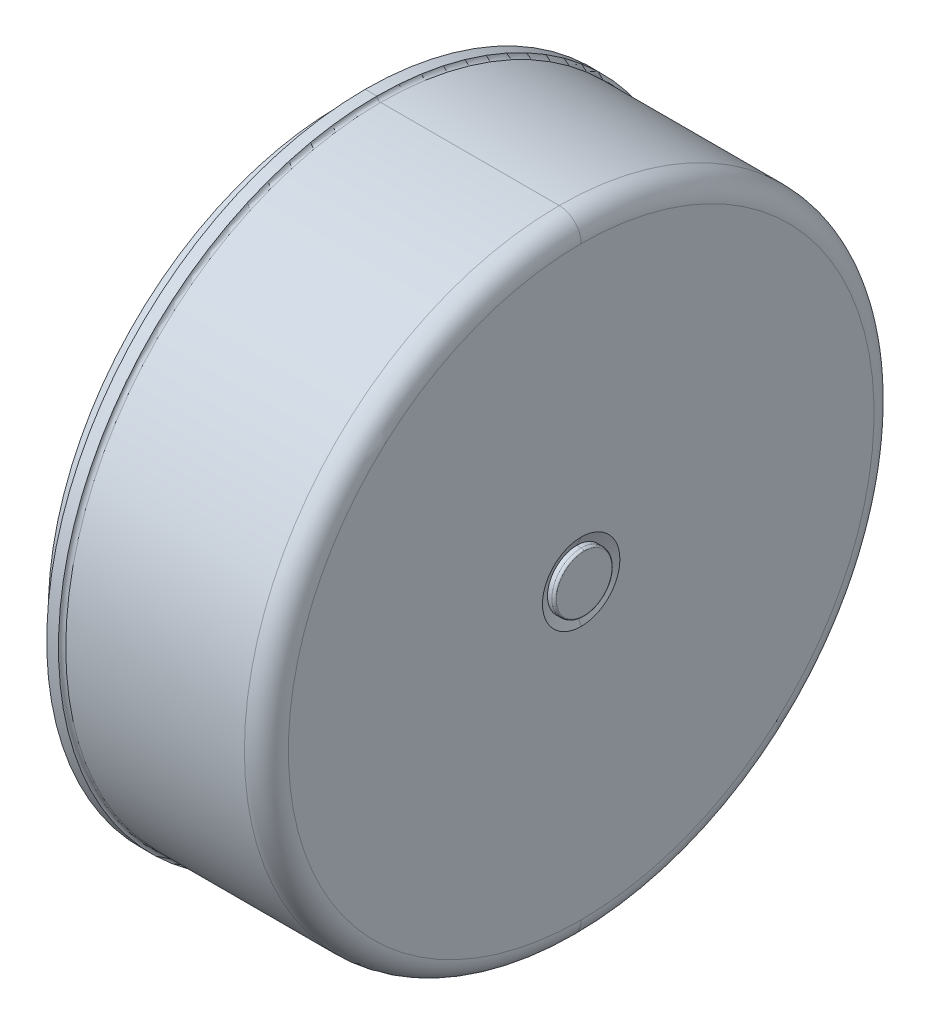
ISO-10303-21;
HEADER;
FILE_DESCRIPTION(('STEP AP214'),'2;1');
FILE_NAME('part.step','',(''),(''),'','','');
FILE_SCHEMA(('AUTOMOTIVE_DESIGN { 1 0 10303 214 1 1 1 1 }'));
ENDSEC;
DATA;
#1=APPLICATION_CONTEXT('core data for automotive mechanical design processes');
#2=APPLICATION_PROTOCOL_DEFINITION('international standard','automotive_design',2000,#1);
#3=PRODUCT_CONTEXT('',#1,'mechanical');
#4=PRODUCT('Part','Part','',(#3));
#5=PRODUCT_RELATED_PRODUCT_CATEGORY('part','',(#4));
#6=PRODUCT_DEFINITION_FORMATION('','',#4);
#7=PRODUCT_DEFINITION_CONTEXT('part definition',#1,'design');
#8=PRODUCT_DEFINITION('design','',#6,#7);
#9=PRODUCT_DEFINITION_SHAPE('','',#8);
#10=(LENGTH_UNIT() NAMED_UNIT(*) SI_UNIT(.MILLI.,.METRE.));
#11=(NAMED_UNIT(*) PLANE_ANGLE_UNIT() SI_UNIT($,.RADIAN.));
#12=(NAMED_UNIT(*) SI_UNIT($,.STERADIAN.) SOLID_ANGLE_UNIT());
#13=UNCERTAINTY_MEASURE_WITH_UNIT(LENGTH_MEASURE(1.E-05),#10,'distance_accuracy_value','');
#14=(GEOMETRIC_REPRESENTATION_CONTEXT(3) GLOBAL_UNCERTAINTY_ASSIGNED_CONTEXT((#13)) GLOBAL_UNIT_ASSIGNED_CONTEXT((#10,
#11,#12)) REPRESENTATION_CONTEXT('',''));
#15=CARTESIAN_POINT('',(0.,0.,0.));
#16=DIRECTION('',(0.,0.,1.));
#17=DIRECTION('',(1.,0.,0.));
#18=AXIS2_PLACEMENT_3D('',#15,#16,#17);
#19=CARTESIAN_POINT('',(5.6,0.,0.));
#20=DIRECTION('',(1.,0.,0.));
#21=DIRECTION('',(0.,0.,-1.));
#22=AXIS2_PLACEMENT_3D('',#19,#20,#21);
#23=PLANE('',#22);
#24=CARTESIAN_POINT('',(5.6,0.,0.));
#25=DIRECTION('',(-1.,0.,0.));
#26=DIRECTION('',(0.,1.,0.));
#27=AXIS2_PLACEMENT_3D('',#24,#25,#26);
#28=CIRCLE('',#27,20.);
#29=CARTESIAN_POINT('',(5.6,20.,0.));
#30=VERTEX_POINT('',#29);
#31=CARTESIAN_POINT('',(5.6,-20.,0.));
#32=VERTEX_POINT('',#31);
#33=EDGE_CURVE('E56',#30,#32,#28,.T.);
#34=ORIENTED_EDGE('',*,*,#33,.T.);
#35=CARTESIAN_POINT('',(5.6,0.,0.));
#36=DIRECTION('',(1.,0.,0.));
#37=DIRECTION('',(0.,1.,0.));
#38=AXIS2_PLACEMENT_3D('',#35,#36,#37);
#39=CIRCLE('',#38,20.);
#40=EDGE_CURVE('E11',#30,#32,#39,.T.);
#41=ORIENTED_EDGE('',*,*,#40,.F.);
#42=EDGE_LOOP('',(#34,#41));
#43=FACE_BOUND('',#42,.T.);
#44=CARTESIAN_POINT('',(5.6,-5.5,9.526279441629));
#45=DIRECTION('',(1.,0.,0.));
#46=DIRECTION('',(0.,0.,-1.));
#47=AXIS2_PLACEMENT_3D('',#44,#45,#46);
#48=CIRCLE('',#47,1.25);
#49=CARTESIAN_POINT('',(5.6,-4.25,9.526279441629));
#50=VERTEX_POINT('',#49);
#51=CARTESIAN_POINT('',(5.6,-6.75,9.526279441629));
#52=VERTEX_POINT('',#51);
#53=EDGE_CURVE('E331',#50,#52,#48,.F.);
#54=ORIENTED_EDGE('',*,*,#53,.F.);
#55=CARTESIAN_POINT('',(5.6,-5.5,9.526279441629));
#56=DIRECTION('',(1.,0.,0.));
#57=DIRECTION('',(0.,0.,-1.));
#58=AXIS2_PLACEMENT_3D('',#55,#56,#57);
#59=CIRCLE('',#58,1.25);
#60=EDGE_CURVE('E1098',#52,#50,#59,.F.);
#61=ORIENTED_EDGE('',*,*,#60,.F.);
#62=EDGE_LOOP('',(#54,#61));
#63=FACE_BOUND('',#62,.T.);
#64=CARTESIAN_POINT('',(5.6,-5.5,-9.526279441629));
#65=DIRECTION('',(1.,0.,0.));
#66=DIRECTION('',(0.,0.,-1.));
#67=AXIS2_PLACEMENT_3D('',#64,#65,#66);
#68=CIRCLE('',#67,1.25);
#69=CARTESIAN_POINT('',(5.6,-6.125,-8.443747686898));
#70=VERTEX_POINT('',#69);
#71=CARTESIAN_POINT('',(5.6,-4.875,-10.60881119636));
#72=VERTEX_POINT('',#71);
#73=EDGE_CURVE('E1096',#70,#72,#68,.F.);
#74=ORIENTED_EDGE('',*,*,#73,.F.);
#75=CARTESIAN_POINT('',(5.6,-5.5,-9.526279441629));
#76=DIRECTION('',(1.,0.,0.));
#77=DIRECTION('',(0.,0.,-1.));
#78=AXIS2_PLACEMENT_3D('',#75,#76,#77);
#79=CIRCLE('',#78,1.25);
#80=EDGE_CURVE('E207',#72,#70,#79,.F.);
#81=ORIENTED_EDGE('',*,*,#80,.F.);
#82=EDGE_LOOP('',(#74,#81));
#83=FACE_BOUND('',#82,.T.);
#84=CARTESIAN_POINT('',(5.6,11.,0.));
#85=DIRECTION('',(1.,0.,0.));
#86=DIRECTION('',(0.,0.,-1.));
#87=AXIS2_PLACEMENT_3D('',#84,#85,#86);
#88=CIRCLE('',#87,1.25);
#89=CARTESIAN_POINT('',(5.6,10.375,-1.082531754731));
#90=VERTEX_POINT('',#89);
#91=CARTESIAN_POINT('',(5.6,11.625,1.082531754731));
#92=VERTEX_POINT('',#91);
#93=EDGE_CURVE('E360',#90,#92,#88,.F.);
#94=ORIENTED_EDGE('',*,*,#93,.F.);
#95=CARTESIAN_POINT('',(5.6,11.,0.));
#96=DIRECTION('',(1.,0.,0.));
#97=DIRECTION('',(0.,0.,-1.));
#98=AXIS2_PLACEMENT_3D('',#95,#96,#97);
#99=CIRCLE('',#98,1.25);
#100=EDGE_CURVE('E367',#92,#90,#99,.F.);
#101=ORIENTED_EDGE('',*,*,#100,.F.);
#102=EDGE_LOOP('',(#94,#101));
#103=FACE_BOUND('',#102,.T.);
#104=ADVANCED_FACE('F53',(#43,#63,#83,#103),#23,.F.);
#105=CARTESIAN_POINT('',(22.2,0.,0.));
#106=DIRECTION('',(1.,0.,0.));
#107=DIRECTION('',(0.,1.,0.));
#108=AXIS2_PLACEMENT_3D('',#105,#106,#107);
#109=PLANE('',#108);
#110=CARTESIAN_POINT('',(22.2,0.,0.));
#111=DIRECTION('',(1.,0.,0.));
#112=DIRECTION('',(0.,1.,0.));
#113=AXIS2_PLACEMENT_3D('',#110,#111,#112);
#114=CIRCLE('',#113,1.9);
#115=CARTESIAN_POINT('',(22.2,1.9,0.));
#116=VERTEX_POINT('',#115);
#117=CARTESIAN_POINT('',(22.2,-1.9,0.));
#118=VERTEX_POINT('',#117);
#119=EDGE_CURVE('E543',#116,#118,#114,.T.);
#120=ORIENTED_EDGE('',*,*,#119,.T.);
#121=CARTESIAN_POINT('',(22.2,0.,0.));
#122=DIRECTION('',(-1.,0.,0.));
#123=DIRECTION('',(0.,1.,0.));
#124=AXIS2_PLACEMENT_3D('',#121,#122,#123);
#125=CIRCLE('',#124,1.9);
#126=EDGE_CURVE('E155',#116,#118,#125,.T.);
#127=ORIENTED_EDGE('',*,*,#126,.F.);
#128=EDGE_LOOP('',(#120,#127));
#129=FACE_BOUND('',#128,.T.);
#130=ADVANCED_FACE('F424',(#129),#109,.T.);
#131=CARTESIAN_POINT('',(22.,2.,0.));
#132=CARTESIAN_POINT('',(22.05,2.,0.));
#133=CARTESIAN_POINT('',(22.11332370056,1.988323700558,0.));
#134=CARTESIAN_POINT('',(22.17599443568,1.950994435682,0.));
#135=CARTESIAN_POINT('',(22.2,1.925,0.));
#136=CARTESIAN_POINT('',(22.2,1.9,0.));
#137=(BOUNDED_CURVE() B_SPLINE_CURVE(3,(#131,#132,#133,#134,#135,#136),.UNSPECIFIED.,.F.,
.F.) B_SPLINE_CURVE_WITH_KNOTS((4,1,1,4),(0.,0.5,0.75,1.),
.UNSPECIFIED.) CURVE() GEOMETRIC_REPRESENTATION_ITEM() RATIONAL_B_SPLINE_CURVE((1.,1.,1.,1.,1.,1.)) REPRESENTATION_ITEM(''));
#138=CARTESIAN_POINT('',(0.,0.,0.));
#139=DIRECTION('',(-1.,0.,0.));
#140=AXIS1_PLACEMENT('',#138,#139);
#141=SURFACE_OF_REVOLUTION('',#137,#140);
#142=CARTESIAN_POINT('',(22.2,1.9,0.));
#143=CARTESIAN_POINT('',(22.1999999963486,1.90076972409339,0.));
#144=CARTESIAN_POINT('',(22.1999886217891,1.90153949709287,0.));
#145=CARTESIAN_POINT('',(22.1999423446817,1.90305618790682,0.));
#146=CARTESIAN_POINT('',(22.1999081275483,1.90380312691137,0.));
#147=CARTESIAN_POINT('',(22.19981681051,1.90527477820813,0.));
#148=CARTESIAN_POINT('',(22.199760373235,1.90599953110398,0.));
#149=CARTESIAN_POINT('',(22.1996252603649,1.90742740269701,0.));
#150=CARTESIAN_POINT('',(22.1995472203907,1.9081305812576,0.));
#151=CARTESIAN_POINT('',(22.1993695523586,1.9095159074431,0.));
#152=CARTESIAN_POINT('',(22.1992705286844,1.91019813228242,0.));
#153=CARTESIAN_POINT('',(22.1990515473371,1.91154215368517,0.));
#154=CARTESIAN_POINT('',(22.198932158955,1.91220404275525,0.));
#155=CARTESIAN_POINT('',(22.1986731061727,1.91350799819556,0.));
#156=CARTESIAN_POINT('',(22.1985339725816,1.9141501698093,0.));
#157=CARTESIAN_POINT('',(22.1982360906019,1.91541529846603,0.));
#158=CARTESIAN_POINT('',(22.198077831773,1.91603837060995,0.));
#159=CARTESIAN_POINT('',(22.1977423631221,1.91726591154533,0.));
#160=CARTESIAN_POINT('',(22.1975655995829,1.91787050217099,0.));
#161=CARTESIAN_POINT('',(22.1971937870899,1.91906169454605,0.));
#162=CARTESIAN_POINT('',(22.1969991399462,1.9196484216248,0.));
#163=CARTESIAN_POINT('',(22.1965922267156,1.92080450474062,0.));
#164=CARTESIAN_POINT('',(22.1963803176522,1.92137398638699,0.));
#165=CARTESIAN_POINT('',(22.1959395470276,1.92249619976858,0.));
#166=CARTESIAN_POINT('',(22.1957109982758,1.92304905434195,0.));
#167=CARTESIAN_POINT('',(22.1952376137846,1.92413863780363,0.));
#168=CARTESIAN_POINT('',(22.1949930480571,1.92467548400372,0.));
#169=CARTESIAN_POINT('',(22.1944882933531,1.92573367769828,0.));
#170=CARTESIAN_POINT('',(22.1942283337643,1.92625513463076,0.));
#171=CARTESIAN_POINT('',(22.193693452532,1.92728317910387,0.));
#172=CARTESIAN_POINT('',(22.1934187224603,1.92778986635144,0.));
#173=CARTESIAN_POINT('',(22.1928549584296,1.92878900249355,0.));
#174=CARTESIAN_POINT('',(22.1925660815194,1.92928154004604,0.));
#175=CARTESIAN_POINT('',(22.1919746780725,1.93025300933252,0.));
#176=CARTESIAN_POINT('',(22.191672277683,1.93073201790467,0.));
#177=CARTESIAN_POINT('',(22.1910544789802,1.9316770614859,0.));
#178=CARTESIAN_POINT('',(22.1907391796865,1.93214316127871,0.));
#179=CARTESIAN_POINT('',(22.1900962262261,1.9330630232324,0.));
#180=CARTESIAN_POINT('',(22.1897686477768,1.93351683833551,0.));
#181=CARTESIAN_POINT('',(22.1891017925865,1.93441275346625,0.));
#182=CARTESIAN_POINT('',(22.1887625718607,1.93485489529193,0.));
#183=CARTESIAN_POINT('',(22.1877296909386,1.93616292188001,0.));
#184=CARTESIAN_POINT('',(22.1870178917349,1.93701456196849,0.));
#185=CARTESIAN_POINT('',(22.1855550726117,1.9386783107714,0.));
#186=CARTESIAN_POINT('',(22.1848041877525,1.93949053902511,0.));
#187=CARTESIAN_POINT('',(22.1832682569264,1.94108064909264,0.));
#188=CARTESIAN_POINT('',(22.1824832388966,1.94185855798304,0.));
#189=CARTESIAN_POINT('',(22.1808840911699,1.94338506729576,0.));
#190=CARTESIAN_POINT('',(22.180069937876,1.94413364288357,0.));
#191=CARTESIAN_POINT('',(22.1784174951616,1.9456065161494,0.));
#192=CARTESIAN_POINT('',(22.1775791660817,1.94633076915663,0.));
#193=CARTESIAN_POINT('',(22.1758833514163,1.94775997424288,0.));
#194=CARTESIAN_POINT('',(22.1750258298209,1.94846488333931,0.));
#195=CARTESIAN_POINT('',(22.1724288876869,1.95056055147684,0.));
#196=CARTESIAN_POINT('',(22.170670338509,1.95192769203043,0.));
#197=CARTESIAN_POINT('',(22.1670962989447,1.95460501915037,0.));
#198=CARTESIAN_POINT('',(22.16528056173,1.95591487573703,0.));
#199=CARTESIAN_POINT('',(22.1615922343171,1.95847783579483,0.));
#200=CARTESIAN_POINT('',(22.1597193549011,1.95973052298195,0.));
#201=CARTESIAN_POINT('',(22.1559168668612,1.96217929353493,0.));
#202=CARTESIAN_POINT('',(22.1539869359123,1.96337487606539,0.));
#203=CARTESIAN_POINT('',(22.1500704472482,1.96570959781149,0.));
#204=CARTESIAN_POINT('',(22.1480835428396,1.96684815508455,0.));
#205=CARTESIAN_POINT('',(22.1440532047216,1.96906897932263,0.));
#206=CARTESIAN_POINT('',(22.1420094083861,1.97015058769423,0.));
#207=CARTESIAN_POINT('',(22.1378653723998,1.9722576637224,0.));
#208=CARTESIAN_POINT('',(22.1357647619658,1.97328240157505,0.));
#209=CARTESIAN_POINT('',(22.1315071848741,1.97527587880338,0.));
#210=CARTESIAN_POINT('',(22.1293498464536,1.97624382330156,0.));
#211=CARTESIAN_POINT('',(22.12497883327,1.9781238671592,0.));
#212=CARTESIAN_POINT('',(22.1227647912511,1.97903511243054,0.));
#213=CARTESIAN_POINT('',(22.1182802141301,1.98080152777479,0.));
#214=CARTESIAN_POINT('',(22.1160093196038,1.98165578198373,0.));
#215=CARTESIAN_POINT('',(22.1090606626561,1.98415235436172,0.));
#216=CARTESIAN_POINT('',(22.1043438019041,1.98568695065004,0.));
#217=CARTESIAN_POINT('',(22.0946823930452,1.98853318323209,0.));
#218=CARTESIAN_POINT('',(22.0897353530705,1.98983627368044,0.));
#219=CARTESIAN_POINT('',(22.0796107605387,1.99221827886771,0.));
#220=CARTESIAN_POINT('',(22.0744310785397,1.99328809728031,0.));
#221=CARTESIAN_POINT('',(22.0638388600609,1.99520192813131,0.));
#222=CARTESIAN_POINT('',(22.0584246296585,1.99603647731862,0.));
#223=CARTESIAN_POINT('',(22.0473607171085,1.9974779722336,0.));
#224=CARTESIAN_POINT('',(22.0417097894869,1.99807526018237,0.));
#225=CARTESIAN_POINT('',(22.0301701457211,1.99904044324431,0.));
#226=CARTESIAN_POINT('',(22.0242806376055,1.99939863985782,0.));
#227=CARTESIAN_POINT('',(22.0122605941812,1.9998829748011,0.));
#228=CARTESIAN_POINT('',(22.0061296609684,1.99999946566372,0.));
#229=CARTESIAN_POINT('',(22.,2.,0.));
#230=B_SPLINE_CURVE_WITH_KNOTS('',3,(#142,#143,#144,#145,#146,#147,#148,#149,#150,#151,#152,
#153,#154,#155,#156,#157,#158,#159,#160,#161,#162,#163,#164,#165,#166,#167,#168,#169,#170,#171,
#172,#173,#174,#175,#176,#177,#178,#179,#180,#181,#182,#183,#184,#185,#186,#187,#188,#189,#190,
#191,#192,#193,#194,#195,#196,#197,#198,#199,#200,#201,#202,#203,#204,#205,#206,#207,#208,#209,
#210,#211,#212,#213,#214,#215,#216,#217,#218,#219,#220,#221,#222,#223,#224,#225,#226,#227,#228,
#229),.UNSPECIFIED.,.F.,.F.,(4,2,2,2,2,2,2,2,2,2,2,2,2,2,2,2,2,2,2,2,2,2,2,2,2,2,2,2,2,2,2,2,2,
2,2,2,2,2,2,2,2,2,2,4),(0.,0.00230915902818518,0.00455196956525164,0.0067324259475015,
0.00885452392010384,0.0109222477001617,0.0129395553961479,0.0149103629411108,0.0168385267847553,
0.0187278256764038,0.0205819419490742,0.0224044427765769,0.0241987619134426,0.0259681824360872,
0.0277158209805459,0.0294446139182486,0.0311573058308861,0.0328564405458137,0.0345443548835183,
0.0362231751577572,0.0378948163662452,0.041222887186978,0.0445401361207777,0.0478547192822488,
0.0511720505780285,0.0544951738756183,0.0578251650591542,0.0645059916752151,0.0712212627904091,
0.0779794579577462,0.0847888626802041,0.0916575437838994,0.098593328274363,0.105603785801629,
0.112696214745119,0.119877722511908,0.127155536801351,0.142026841802226,0.157366588369195,
0.173226315296921,0.189654254399268,0.206695356291891,0.22439139844897,0.242781150163145),.UNSPECIFIED.);
#231=CARTESIAN_POINT('',(22.,2.,0.));
#232=VERTEX_POINT('',#231);
#233=EDGE_CURVE('E546',#116,#232,#230,.T.);
#234=ORIENTED_EDGE('',*,*,#233,.F.);
#235=ORIENTED_EDGE('',*,*,#126,.T.);
#236=CARTESIAN_POINT('',(22.2,-1.9,0.));
#237=CARTESIAN_POINT('',(22.1999999963486,-1.90076972409339,0.));
#238=CARTESIAN_POINT('',(22.1999886217891,-1.90153949709287,0.));
#239=CARTESIAN_POINT('',(22.1999423446817,-1.90305618790682,0.));
#240=CARTESIAN_POINT('',(22.1999081275483,-1.90380312691137,0.));
#241=CARTESIAN_POINT('',(22.19981681051,-1.90527477820813,0.));
#242=CARTESIAN_POINT('',(22.199760373235,-1.90599953110398,0.));
#243=CARTESIAN_POINT('',(22.1996252603649,-1.90742740269701,0.));
#244=CARTESIAN_POINT('',(22.1995472203907,-1.9081305812576,0.));
#245=CARTESIAN_POINT('',(22.1993695523586,-1.9095159074431,0.));
#246=CARTESIAN_POINT('',(22.1992705286844,-1.91019813228242,0.));
#247=CARTESIAN_POINT('',(22.1990515473371,-1.91154215368517,0.));
#248=CARTESIAN_POINT('',(22.198932158955,-1.91220404275525,0.));
#249=CARTESIAN_POINT('',(22.1986731061727,-1.91350799819556,0.));
#250=CARTESIAN_POINT('',(22.1985339725816,-1.9141501698093,0.));
#251=CARTESIAN_POINT('',(22.1982360906019,-1.91541529846603,0.));
#252=CARTESIAN_POINT('',(22.198077831773,-1.91603837060995,0.));
#253=CARTESIAN_POINT('',(22.1977423631221,-1.91726591154533,0.));
#254=CARTESIAN_POINT('',(22.1975655995829,-1.91787050217099,0.));
#255=CARTESIAN_POINT('',(22.1971937870899,-1.91906169454605,0.));
#256=CARTESIAN_POINT('',(22.1969991399462,-1.9196484216248,0.));
#257=CARTESIAN_POINT('',(22.1965922267156,-1.92080450474062,0.));
#258=CARTESIAN_POINT('',(22.1963803176522,-1.92137398638699,0.));
#259=CARTESIAN_POINT('',(22.1959395470276,-1.92249619976858,0.));
#260=CARTESIAN_POINT('',(22.1957109982758,-1.92304905434195,0.));
#261=CARTESIAN_POINT('',(22.1952376137846,-1.92413863780363,0.));
#262=CARTESIAN_POINT('',(22.1949930480571,-1.92467548400372,0.));
#263=CARTESIAN_POINT('',(22.1944882933531,-1.92573367769828,0.));
#264=CARTESIAN_POINT('',(22.1942283337643,-1.92625513463076,0.));
#265=CARTESIAN_POINT('',(22.193693452532,-1.92728317910387,0.));
#266=CARTESIAN_POINT('',(22.1934187224603,-1.92778986635144,0.));
#267=CARTESIAN_POINT('',(22.1928549584296,-1.92878900249355,0.));
#268=CARTESIAN_POINT('',(22.1925660815194,-1.92928154004604,0.));
#269=CARTESIAN_POINT('',(22.1919746780725,-1.93025300933252,0.));
#270=CARTESIAN_POINT('',(22.191672277683,-1.93073201790467,0.));
#271=CARTESIAN_POINT('',(22.1910544789802,-1.9316770614859,0.));
#272=CARTESIAN_POINT('',(22.1907391796865,-1.93214316127871,0.));
#273=CARTESIAN_POINT('',(22.1900962262261,-1.9330630232324,0.));
#274=CARTESIAN_POINT('',(22.1897686477768,-1.93351683833551,0.));
#275=CARTESIAN_POINT('',(22.1891017925865,-1.93441275346625,0.));
#276=CARTESIAN_POINT('',(22.1887625718607,-1.93485489529193,0.));
#277=CARTESIAN_POINT('',(22.1877296909386,-1.93616292188001,0.));
#278=CARTESIAN_POINT('',(22.1870178917349,-1.93701456196849,0.));
#279=CARTESIAN_POINT('',(22.1855550726117,-1.9386783107714,0.));
#280=CARTESIAN_POINT('',(22.1848041877525,-1.93949053902511,0.));
#281=CARTESIAN_POINT('',(22.1832682569264,-1.94108064909264,0.));
#282=CARTESIAN_POINT('',(22.1824832388966,-1.94185855798304,0.));
#283=CARTESIAN_POINT('',(22.1808840911699,-1.94338506729576,0.));
#284=CARTESIAN_POINT('',(22.180069937876,-1.94413364288357,0.));
#285=CARTESIAN_POINT('',(22.1784174951616,-1.9456065161494,0.));
#286=CARTESIAN_POINT('',(22.1775791660817,-1.94633076915663,0.));
#287=CARTESIAN_POINT('',(22.1758833514163,-1.94775997424288,0.));
#288=CARTESIAN_POINT('',(22.1750258298209,-1.94846488333931,0.));
#289=CARTESIAN_POINT('',(22.1724288876869,-1.95056055147684,0.));
#290=CARTESIAN_POINT('',(22.170670338509,-1.95192769203043,0.));
#291=CARTESIAN_POINT('',(22.1670962989447,-1.95460501915037,0.));
#292=CARTESIAN_POINT('',(22.16528056173,-1.95591487573703,0.));
#293=CARTESIAN_POINT('',(22.1615922343171,-1.95847783579483,0.));
#294=CARTESIAN_POINT('',(22.1597193549011,-1.95973052298195,0.));
#295=CARTESIAN_POINT('',(22.1559168668612,-1.96217929353493,0.));
#296=CARTESIAN_POINT('',(22.1539869359123,-1.96337487606539,0.));
#297=CARTESIAN_POINT('',(22.1500704472482,-1.96570959781149,0.));
#298=CARTESIAN_POINT('',(22.1480835428396,-1.96684815508455,0.));
#299=CARTESIAN_POINT('',(22.1440532047216,-1.96906897932263,0.));
#300=CARTESIAN_POINT('',(22.1420094083861,-1.97015058769423,0.));
#301=CARTESIAN_POINT('',(22.1378653723998,-1.9722576637224,0.));
#302=CARTESIAN_POINT('',(22.1357647619658,-1.97328240157505,0.));
#303=CARTESIAN_POINT('',(22.1315071848741,-1.97527587880338,0.));
#304=CARTESIAN_POINT('',(22.1293498464536,-1.97624382330156,0.));
#305=CARTESIAN_POINT('',(22.12497883327,-1.9781238671592,0.));
#306=CARTESIAN_POINT('',(22.1227647912511,-1.97903511243054,0.));
#307=CARTESIAN_POINT('',(22.1182802141301,-1.98080152777479,0.));
#308=CARTESIAN_POINT('',(22.1160093196038,-1.98165578198373,0.));
#309=CARTESIAN_POINT('',(22.1090606626561,-1.98415235436172,0.));
#310=CARTESIAN_POINT('',(22.1043438019041,-1.98568695065004,0.));
#311=CARTESIAN_POINT('',(22.0946823930452,-1.98853318323209,0.));
#312=CARTESIAN_POINT('',(22.0897353530705,-1.98983627368044,0.));
#313=CARTESIAN_POINT('',(22.0796107605387,-1.99221827886771,0.));
#314=CARTESIAN_POINT('',(22.0744310785397,-1.99328809728031,0.));
#315=CARTESIAN_POINT('',(22.0638388600609,-1.99520192813131,0.));
#316=CARTESIAN_POINT('',(22.0584246296585,-1.99603647731862,0.));
#317=CARTESIAN_POINT('',(22.0473607171085,-1.9974779722336,0.));
#318=CARTESIAN_POINT('',(22.0417097894869,-1.99807526018237,0.));
#319=CARTESIAN_POINT('',(22.0301701457211,-1.99904044324431,0.));
#320=CARTESIAN_POINT('',(22.0242806376055,-1.99939863985782,0.));
#321=CARTESIAN_POINT('',(22.0122605941812,-1.9998829748011,0.));
#322=CARTESIAN_POINT('',(22.0061296609684,-1.99999946566372,0.));
#323=CARTESIAN_POINT('',(22.,-2.,0.));
#324=B_SPLINE_CURVE_WITH_KNOTS('',3,(#236,#237,#238,#239,#240,#241,#242,#243,#244,#245,#246,
#247,#248,#249,#250,#251,#252,#253,#254,#255,#256,#257,#258,#259,#260,#261,#262,#263,#264,#265,
#266,#267,#268,#269,#270,#271,#272,#273,#274,#275,#276,#277,#278,#279,#280,#281,#282,#283,#284,
#285,#286,#287,#288,#289,#290,#291,#292,#293,#294,#295,#296,#297,#298,#299,#300,#301,#302,#303,
#304,#305,#306,#307,#308,#309,#310,#311,#312,#313,#314,#315,#316,#317,#318,#319,#320,#321,#322,
#323),.UNSPECIFIED.,.F.,.F.,(4,2,2,2,2,2,2,2,2,2,2,2,2,2,2,2,2,2,2,2,2,2,2,2,2,2,2,2,2,2,2,2,2,
2,2,2,2,2,2,2,2,2,2,4),(0.,0.00230915902818518,0.00455196956525164,0.0067324259475015,
0.00885452392010384,0.0109222477001617,0.0129395553961479,0.0149103629411108,0.0168385267847553,
0.0187278256764038,0.0205819419490742,0.0224044427765769,0.0241987619134426,0.0259681824360872,
0.0277158209805459,0.0294446139182486,0.0311573058308861,0.0328564405458137,0.0345443548835183,
0.0362231751577572,0.0378948163662452,0.041222887186978,0.0445401361207777,0.0478547192822488,
0.0511720505780285,0.0544951738756183,0.0578251650591542,0.0645059916752151,0.0712212627904091,
0.0779794579577462,0.0847888626802041,0.0916575437838994,0.098593328274363,0.105603785801629,
0.112696214745119,0.119877722511908,0.127155536801351,0.142026841802226,0.157366588369195,
0.173226315296921,0.189654254399268,0.206695356291891,0.22439139844897,0.242781150163145),.UNSPECIFIED.);
#325=CARTESIAN_POINT('',(22.,-2.,0.));
#326=VERTEX_POINT('',#325);
#327=EDGE_CURVE('E536',#118,#326,#324,.T.);
#328=ORIENTED_EDGE('',*,*,#327,.T.);
#329=CARTESIAN_POINT('',(22.,0.,0.));
#330=DIRECTION('',(-1.,0.,0.));
#331=DIRECTION('',(0.,1.,0.));
#332=AXIS2_PLACEMENT_3D('',#329,#330,#331);
#333=CIRCLE('',#332,2.);
#334=EDGE_CURVE('E319',#232,#326,#333,.T.);
#335=ORIENTED_EDGE('',*,*,#334,.F.);
#336=EDGE_LOOP('',(#234,#235,#328,#335));
#337=FACE_BOUND('',#336,.T.);
#338=ADVANCED_FACE('F429',(#337),#141,.F.);
#339=CARTESIAN_POINT('',(22.,2.,0.));
#340=CARTESIAN_POINT('',(22.05,2.,0.));
#341=CARTESIAN_POINT('',(22.11332370056,1.988323700558,0.));
#342=CARTESIAN_POINT('',(22.17599443568,1.950994435682,0.));
#343=CARTESIAN_POINT('',(22.2,1.925,0.));
#344=CARTESIAN_POINT('',(22.2,1.9,0.));
#345=(BOUNDED_CURVE() B_SPLINE_CURVE(3,(#339,#340,#341,#342,#343,#344),.UNSPECIFIED.,.F.,
.F.) B_SPLINE_CURVE_WITH_KNOTS((4,1,1,4),(0.,0.5,0.75,1.),
.UNSPECIFIED.) CURVE() GEOMETRIC_REPRESENTATION_ITEM() RATIONAL_B_SPLINE_CURVE((1.,1.,1.,1.,1.,1.)) REPRESENTATION_ITEM(''));
#346=CARTESIAN_POINT('',(0.,0.,0.));
#347=DIRECTION('',(-1.,0.,0.));
#348=AXIS1_PLACEMENT('',#346,#347);
#349=SURFACE_OF_REVOLUTION('',#345,#348);
#350=ORIENTED_EDGE('',*,*,#327,.F.);
#351=ORIENTED_EDGE('',*,*,#119,.F.);
#352=ORIENTED_EDGE('',*,*,#233,.T.);
#353=CARTESIAN_POINT('',(22.,0.,0.));
#354=DIRECTION('',(-1.,0.,0.));
#355=DIRECTION('',(0.,-1.,0.));
#356=AXIS2_PLACEMENT_3D('',#353,#354,#355);
#357=CIRCLE('',#356,2.);
#358=EDGE_CURVE('E521',#326,#232,#357,.T.);
#359=ORIENTED_EDGE('',*,*,#358,.F.);
#360=EDGE_LOOP('',(#350,#351,#352,#359));
#361=FACE_BOUND('',#360,.T.);
#362=ADVANCED_FACE('F566',(#361),#349,.F.);
#363=CARTESIAN_POINT('',(22.015,0.,0.));
#364=DIRECTION('',(-1.,0.,0.));
#365=DIRECTION('',(0.,1.,0.));
#366=AXIS2_PLACEMENT_3D('',#363,#364,#365);
#367=CYLINDRICAL_SURFACE('',#366,2.);
#368=DIRECTION('',(1.,0.,0.));
#369=VECTOR('',#368,1.);
#370=CARTESIAN_POINT('',(21.7,-2.,0.));
#371=LINE('',#370,#369);
#372=CARTESIAN_POINT('',(21.7,-2.,0.));
#373=VERTEX_POINT('',#372);
#374=EDGE_CURVE('E517',#373,#326,#371,.T.);
#375=ORIENTED_EDGE('',*,*,#374,.F.);
#376=CARTESIAN_POINT('',(21.7,0.,0.));
#377=DIRECTION('',(-1.,0.,0.));
#378=DIRECTION('',(0.,1.,0.));
#379=AXIS2_PLACEMENT_3D('',#376,#377,#378);
#380=CIRCLE('',#379,2.);
#381=CARTESIAN_POINT('',(21.7,2.,0.));
#382=VERTEX_POINT('',#381);
#383=EDGE_CURVE('E243',#382,#373,#380,.T.);
#384=ORIENTED_EDGE('',*,*,#383,.F.);
#385=DIRECTION('',(1.,0.,0.));
#386=VECTOR('',#385,1.);
#387=CARTESIAN_POINT('',(21.7,2.,0.));
#388=LINE('',#387,#386);
#389=EDGE_CURVE('E237',#382,#232,#388,.T.);
#390=ORIENTED_EDGE('',*,*,#389,.T.);
#391=ORIENTED_EDGE('',*,*,#334,.T.);
#392=EDGE_LOOP('',(#375,#384,#390,#391));
#393=FACE_BOUND('',#392,.T.);
#394=ADVANCED_FACE('F515',(#393),#367,.T.);
#395=CARTESIAN_POINT('',(22.015,0.,0.));
#396=DIRECTION('',(-1.,0.,0.));
#397=DIRECTION('',(0.,1.,0.));
#398=AXIS2_PLACEMENT_3D('',#395,#396,#397);
#399=CYLINDRICAL_SURFACE('',#398,2.);
#400=ORIENTED_EDGE('',*,*,#389,.F.);
#401=CARTESIAN_POINT('',(21.7,0.,0.));
#402=DIRECTION('',(1.,0.,0.));
#403=DIRECTION('',(0.,1.,0.));
#404=AXIS2_PLACEMENT_3D('',#401,#402,#403);
#405=CIRCLE('',#404,2.);
#406=EDGE_CURVE('E232',#382,#373,#405,.T.);
#407=ORIENTED_EDGE('',*,*,#406,.T.);
#408=ORIENTED_EDGE('',*,*,#374,.T.);
#409=ORIENTED_EDGE('',*,*,#358,.T.);
#410=EDGE_LOOP('',(#400,#407,#408,#409));
#411=FACE_BOUND('',#410,.T.);
#412=ADVANCED_FACE('F498',(#411),#399,.T.);
#413=CARTESIAN_POINT('',(21.85,0.,0.));
#414=DIRECTION('',(1.,0.,0.));
#415=DIRECTION('',(0.,-1.,0.));
#416=AXIS2_PLACEMENT_3D('',#413,#414,#415);
#417=CONICAL_SURFACE('',#416,2.321676038076,1.1344640137961);
#418=DIRECTION('',(-0.422618261740681,-0.906307787036659,0.));
#419=VECTOR('',#418,1.);
#420=CARTESIAN_POINT('',(22.,2.643352076153,0.));
#421=LINE('',#420,#419);
#422=CARTESIAN_POINT('',(22.,2.643352076153,0.));
#423=VERTEX_POINT('',#422);
#424=EDGE_CURVE('E238',#423,#382,#421,.T.);
#425=ORIENTED_EDGE('',*,*,#424,.T.);
#426=ORIENTED_EDGE('',*,*,#383,.T.);
#427=DIRECTION('',(-0.422618261740681,0.906307787036659,0.));
#428=VECTOR('',#427,1.);
#429=CARTESIAN_POINT('',(22.,-2.643352076153,0.));
#430=LINE('',#429,#428);
#431=CARTESIAN_POINT('',(22.,-2.643352076153,0.));
#432=VERTEX_POINT('',#431);
#433=EDGE_CURVE('E236',#432,#373,#430,.T.);
#434=ORIENTED_EDGE('',*,*,#433,.F.);
#435=CARTESIAN_POINT('',(22.,0.,0.));
#436=DIRECTION('',(-1.,0.,0.));
#437=DIRECTION('',(0.,1.,0.));
#438=AXIS2_PLACEMENT_3D('',#435,#436,#437);
#439=CIRCLE('',#438,2.643352076153);
#440=EDGE_CURVE('E242',#423,#432,#439,.T.);
#441=ORIENTED_EDGE('',*,*,#440,.F.);
#442=EDGE_LOOP('',(#425,#426,#434,#441));
#443=FACE_BOUND('',#442,.T.);
#444=ADVANCED_FACE('F495',(#443),#417,.F.);
#445=CARTESIAN_POINT('',(21.85,0.,0.));
#446=DIRECTION('',(1.,0.,0.));
#447=DIRECTION('',(0.,-1.,0.));
#448=AXIS2_PLACEMENT_3D('',#445,#446,#447);
#449=CONICAL_SURFACE('',#448,2.321676038076,1.1344640137961);
#450=ORIENTED_EDGE('',*,*,#433,.T.);
#451=ORIENTED_EDGE('',*,*,#406,.F.);
#452=ORIENTED_EDGE('',*,*,#424,.F.);
#453=CARTESIAN_POINT('',(22.,0.,0.));
#454=DIRECTION('',(-1.,0.,0.));
#455=DIRECTION('',(0.,-1.,0.));
#456=AXIS2_PLACEMENT_3D('',#453,#454,#455);
#457=CIRCLE('',#456,2.643352076153);
#458=EDGE_CURVE('E281',#432,#423,#457,.T.);
#459=ORIENTED_EDGE('',*,*,#458,.F.);
#460=EDGE_LOOP('',(#450,#451,#452,#459));
#461=FACE_BOUND('',#460,.T.);
#462=ADVANCED_FACE('F452',(#461),#449,.F.);
#463=CARTESIAN_POINT('',(22.,0.,0.));
#464=DIRECTION('',(1.,0.,0.));
#465=DIRECTION('',(0.,1.,0.));
#466=AXIS2_PLACEMENT_3D('',#463,#464,#465);
#467=PLANE('',#466);
#468=ORIENTED_EDGE('',*,*,#458,.T.);
#469=ORIENTED_EDGE('',*,*,#440,.T.);
#470=EDGE_LOOP('',(#468,#469));
#471=FACE_BOUND('',#470,.T.);
#472=CARTESIAN_POINT('',(22.,0.,0.));
#473=DIRECTION('',(1.,0.,0.));
#474=DIRECTION('',(0.,1.,0.));
#475=AXIS2_PLACEMENT_3D('',#472,#473,#474);
#476=CIRCLE('',#475,20.);
#477=CARTESIAN_POINT('',(22.,20.,0.));
#478=VERTEX_POINT('',#477);
#479=CARTESIAN_POINT('',(22.,-20.,0.));
#480=VERTEX_POINT('',#479);
#481=EDGE_CURVE('E277',#478,#480,#476,.T.);
#482=ORIENTED_EDGE('',*,*,#481,.T.);
#483=CARTESIAN_POINT('',(22.,0.,0.));
#484=DIRECTION('',(-1.,0.,0.));
#485=DIRECTION('',(0.,1.,0.));
#486=AXIS2_PLACEMENT_3D('',#483,#484,#485);
#487=CIRCLE('',#486,20.);
#488=EDGE_CURVE('E304',#478,#480,#487,.T.);
#489=ORIENTED_EDGE('',*,*,#488,.F.);
#490=EDGE_LOOP('',(#482,#489));
#491=FACE_BOUND('',#490,.T.);
#492=ADVANCED_FACE('F449',(#471,#491),#467,.T.);
#493=CARTESIAN_POINT('',(20.5,0.,0.));
#494=DIRECTION('',(1.,0.,0.));
#495=DIRECTION('',(0.,-1.,0.));
#496=AXIS2_PLACEMENT_3D('',#493,#494,#495);
#497=TOROIDAL_SURFACE('',#496,20.,1.5);
#498=ORIENTED_EDGE('',*,*,#488,.T.);
#499=CARTESIAN_POINT('',(20.5,-20.,0.));
#500=DIRECTION('',(0.,0.,-1.));
#501=DIRECTION('',(1.,0.,0.));
#502=AXIS2_PLACEMENT_3D('',#499,#500,#501);
#503=CIRCLE('',#502,1.5);
#504=CARTESIAN_POINT('',(20.5,-21.5,0.));
#505=VERTEX_POINT('',#504);
#506=EDGE_CURVE('E308',#480,#505,#503,.T.);
#507=ORIENTED_EDGE('',*,*,#506,.T.);
#508=CARTESIAN_POINT('',(20.5,0.,0.));
#509=DIRECTION('',(-1.,0.,0.));
#510=DIRECTION('',(0.,1.,0.));
#511=AXIS2_PLACEMENT_3D('',#508,#509,#510);
#512=CIRCLE('',#511,21.5);
#513=CARTESIAN_POINT('',(20.5,21.5,0.));
#514=VERTEX_POINT('',#513);
#515=EDGE_CURVE('E226',#514,#505,#512,.T.);
#516=ORIENTED_EDGE('',*,*,#515,.F.);
#517=CARTESIAN_POINT('',(20.5,20.,0.));
#518=DIRECTION('',(0.,0.,1.));
#519=DIRECTION('',(1.,0.,0.));
#520=AXIS2_PLACEMENT_3D('',#517,#518,#519);
#521=CIRCLE('',#520,1.5);
#522=EDGE_CURVE('E224',#478,#514,#521,.T.);
#523=ORIENTED_EDGE('',*,*,#522,.F.);
#524=EDGE_LOOP('',(#498,#507,#516,#523));
#525=FACE_BOUND('',#524,.T.);
#526=ADVANCED_FACE('F451',(#525),#497,.T.);
#527=CARTESIAN_POINT('',(20.5,0.,0.));
#528=DIRECTION('',(1.,0.,0.));
#529=DIRECTION('',(0.,-1.,0.));
#530=AXIS2_PLACEMENT_3D('',#527,#528,#529);
#531=TOROIDAL_SURFACE('',#530,20.,1.5);
#532=CARTESIAN_POINT('',(20.5,0.,0.));
#533=DIRECTION('',(1.,0.,0.));
#534=DIRECTION('',(0.,1.,0.));
#535=AXIS2_PLACEMENT_3D('',#532,#533,#534);
#536=CIRCLE('',#535,21.5);
#537=EDGE_CURVE('E342',#514,#505,#536,.T.);
#538=ORIENTED_EDGE('',*,*,#537,.T.);
#539=ORIENTED_EDGE('',*,*,#506,.F.);
#540=ORIENTED_EDGE('',*,*,#481,.F.);
#541=ORIENTED_EDGE('',*,*,#522,.T.);
#542=EDGE_LOOP('',(#538,#539,#540,#541));
#543=FACE_BOUND('',#542,.T.);
#544=ADVANCED_FACE('F470',(#543),#531,.T.);
#545=CARTESIAN_POINT('',(0.,0.,0.));
#546=DIRECTION('',(1.,0.,0.));
#547=DIRECTION('',(0.,-1.,0.));
#548=AXIS2_PLACEMENT_3D('',#545,#546,#547);
#549=CYLINDRICAL_SURFACE('',#548,21.5);
#550=ORIENTED_EDGE('',*,*,#515,.T.);
#551=DIRECTION('',(-1.,0.,0.));
#552=VECTOR('',#551,1.);
#553=CARTESIAN_POINT('',(20.5,-21.5,0.));
#554=LINE('',#553,#552);
#555=CARTESIAN_POINT('',(8.3,-21.5,0.));
#556=VERTEX_POINT('',#555);
#557=EDGE_CURVE('E272',#505,#556,#554,.T.);
#558=ORIENTED_EDGE('',*,*,#557,.T.);
#559=CARTESIAN_POINT('',(8.3,0.,0.));
#560=DIRECTION('',(1.,0.,0.));
#561=DIRECTION('',(0.,-1.,0.));
#562=AXIS2_PLACEMENT_3D('',#559,#560,#561);
#563=CIRCLE('',#562,21.5);
#564=CARTESIAN_POINT('',(8.3,21.5,0.));
#565=VERTEX_POINT('',#564);
#566=EDGE_CURVE('E230',#556,#565,#563,.T.);
#567=ORIENTED_EDGE('',*,*,#566,.T.);
#568=DIRECTION('',(-1.,0.,0.));
#569=VECTOR('',#568,1.);
#570=CARTESIAN_POINT('',(20.5,21.5,0.));
#571=LINE('',#570,#569);
#572=EDGE_CURVE('E229',#514,#565,#571,.T.);
#573=ORIENTED_EDGE('',*,*,#572,.F.);
#574=EDGE_LOOP('',(#550,#558,#567,#573));
#575=FACE_BOUND('',#574,.T.);
#576=ADVANCED_FACE('F480',(#575),#549,.T.);
#577=CARTESIAN_POINT('',(0.,0.,0.));
#578=DIRECTION('',(1.,0.,0.));
#579=DIRECTION('',(0.,-1.,0.));
#580=AXIS2_PLACEMENT_3D('',#577,#578,#579);
#581=CYLINDRICAL_SURFACE('',#580,21.5);
#582=CARTESIAN_POINT('',(8.3,0.,0.));
#583=DIRECTION('',(1.,0.,0.));
#584=DIRECTION('',(0.,1.,0.));
#585=AXIS2_PLACEMENT_3D('',#582,#583,#584);
#586=CIRCLE('',#585,21.5);
#587=EDGE_CURVE('E267',#565,#556,#586,.T.);
#588=ORIENTED_EDGE('',*,*,#587,.T.);
#589=ORIENTED_EDGE('',*,*,#557,.F.);
#590=ORIENTED_EDGE('',*,*,#537,.F.);
#591=ORIENTED_EDGE('',*,*,#572,.T.);
#592=EDGE_LOOP('',(#588,#589,#590,#591));
#593=FACE_BOUND('',#592,.T.);
#594=ADVANCED_FACE('F442',(#593),#581,.T.);
#595=CARTESIAN_POINT('',(8.3,0.,0.));
#596=DIRECTION('',(1.,0.,0.));
#597=DIRECTION('',(0.,-1.,0.));
#598=AXIS2_PLACEMENT_3D('',#595,#596,#597);
#599=TOROIDAL_SURFACE('',#598,21.75,0.25);
#600=CARTESIAN_POINT('',(8.3,-21.75,0.));
#601=DIRECTION('',(0.,0.,1.));
#602=DIRECTION('',(0.,1.,0.));
#603=AXIS2_PLACEMENT_3D('',#600,#601,#602);
#604=CIRCLE('',#603,0.25);
#605=CARTESIAN_POINT('',(8.05,-21.75,0.));
#606=VERTEX_POINT('',#605);
#607=EDGE_CURVE('E271',#556,#606,#604,.T.);
#608=ORIENTED_EDGE('',*,*,#607,.T.);
#609=CARTESIAN_POINT('',(8.05,0.,0.));
#610=DIRECTION('',(-1.,0.,0.));
#611=DIRECTION('',(0.,1.,0.));
#612=AXIS2_PLACEMENT_3D('',#609,#610,#611);
#613=CIRCLE('',#612,21.75);
#614=CARTESIAN_POINT('',(8.05,21.75,0.));
#615=VERTEX_POINT('',#614);
#616=EDGE_CURVE('E261',#615,#606,#613,.T.);
#617=ORIENTED_EDGE('',*,*,#616,.F.);
#618=CARTESIAN_POINT('',(8.3,21.75,0.));
#619=DIRECTION('',(0.,0.,-1.));
#620=DIRECTION('',(0.,-1.,0.));
#621=AXIS2_PLACEMENT_3D('',#618,#619,#620);
#622=CIRCLE('',#621,0.25);
#623=EDGE_CURVE('E276',#565,#615,#622,.T.);
#624=ORIENTED_EDGE('',*,*,#623,.F.);
#625=ORIENTED_EDGE('',*,*,#566,.F.);
#626=EDGE_LOOP('',(#608,#617,#624,#625));
#627=FACE_BOUND('',#626,.T.);
#628=ADVANCED_FACE('F458',(#627),#599,.F.);
#629=CARTESIAN_POINT('',(8.3,0.,0.));
#630=DIRECTION('',(1.,0.,0.));
#631=DIRECTION('',(0.,-1.,0.));
#632=AXIS2_PLACEMENT_3D('',#629,#630,#631);
#633=TOROIDAL_SURFACE('',#632,21.75,0.25);
#634=ORIENTED_EDGE('',*,*,#623,.T.);
#635=CARTESIAN_POINT('',(8.05,0.,0.));
#636=DIRECTION('',(1.,0.,0.));
#637=DIRECTION('',(0.,1.,0.));
#638=AXIS2_PLACEMENT_3D('',#635,#636,#637);
#639=CIRCLE('',#638,21.75);
#640=EDGE_CURVE('E311',#615,#606,#639,.T.);
#641=ORIENTED_EDGE('',*,*,#640,.T.);
#642=ORIENTED_EDGE('',*,*,#607,.F.);
#643=ORIENTED_EDGE('',*,*,#587,.F.);
#644=EDGE_LOOP('',(#634,#641,#642,#643));
#645=FACE_BOUND('',#644,.T.);
#646=ADVANCED_FACE('F455',(#645),#633,.F.);
#647=CARTESIAN_POINT('',(-0.415,0.,0.));
#648=DIRECTION('',(1.,0.,0.));
#649=DIRECTION('',(0.,-1.,0.));
#650=AXIS2_PLACEMENT_3D('',#647,#648,#649);
#651=CYLINDRICAL_SURFACE('',#650,21.75);
#652=ORIENTED_EDGE('',*,*,#616,.T.);
#653=DIRECTION('',(-1.,0.,0.));
#654=VECTOR('',#653,1.);
#655=CARTESIAN_POINT('',(8.05,-21.75,0.));
#656=LINE('',#655,#654);
#657=CARTESIAN_POINT('',(7.25,-21.75,0.));
#658=VERTEX_POINT('',#657);
#659=EDGE_CURVE('E266',#606,#658,#656,.T.);
#660=ORIENTED_EDGE('',*,*,#659,.T.);
#661=CARTESIAN_POINT('',(7.25,0.,0.));
#662=DIRECTION('',(-1.,0.,0.));
#663=DIRECTION('',(0.,1.,0.));
#664=AXIS2_PLACEMENT_3D('',#661,#662,#663);
#665=CIRCLE('',#664,21.75);
#666=CARTESIAN_POINT('',(7.25,21.75,0.));
#667=VERTEX_POINT('',#666);
#668=EDGE_CURVE('E265',#667,#658,#665,.T.);
#669=ORIENTED_EDGE('',*,*,#668,.F.);
#670=DIRECTION('',(-1.,0.,0.));
#671=VECTOR('',#670,1.);
#672=CARTESIAN_POINT('',(8.05,21.75,0.));
#673=LINE('',#672,#671);
#674=EDGE_CURVE('E397',#615,#667,#673,.T.);
#675=ORIENTED_EDGE('',*,*,#674,.F.);
#676=EDGE_LOOP('',(#652,#660,#669,#675));
#677=FACE_BOUND('',#676,.T.);
#678=ADVANCED_FACE('F407',(#677),#651,.T.);
#679=CARTESIAN_POINT('',(-0.415,0.,0.));
#680=DIRECTION('',(1.,0.,0.));
#681=DIRECTION('',(0.,-1.,0.));
#682=AXIS2_PLACEMENT_3D('',#679,#680,#681);
#683=CYLINDRICAL_SURFACE('',#682,21.75);
#684=CARTESIAN_POINT('',(7.25,0.,0.));
#685=DIRECTION('',(1.,0.,0.));
#686=DIRECTION('',(0.,1.,0.));
#687=AXIS2_PLACEMENT_3D('',#684,#685,#686);
#688=CIRCLE('',#687,21.75);
#689=EDGE_CURVE('E282',#667,#658,#688,.T.);
#690=ORIENTED_EDGE('',*,*,#689,.T.);
#691=ORIENTED_EDGE('',*,*,#659,.F.);
#692=ORIENTED_EDGE('',*,*,#640,.F.);
#693=ORIENTED_EDGE('',*,*,#674,.T.);
#694=EDGE_LOOP('',(#690,#691,#692,#693));
#695=FACE_BOUND('',#694,.T.);
#696=ADVANCED_FACE('F399',(#695),#683,.T.);
#697=CARTESIAN_POINT('',(7.25,0.,0.));
#698=DIRECTION('',(1.,0.,0.));
#699=DIRECTION('',(0.,1.,0.));
#700=AXIS2_PLACEMENT_3D('',#697,#698,#699);
#701=PLANE('',#700);
#702=CARTESIAN_POINT('',(7.25,0.,0.));
#703=DIRECTION('',(1.,0.,0.));
#704=DIRECTION('',(0.,1.,0.));
#705=AXIS2_PLACEMENT_3D('',#702,#703,#704);
#706=CIRCLE('',#705,20.);
#707=CARTESIAN_POINT('',(7.25,20.,0.));
#708=VERTEX_POINT('',#707);
#709=CARTESIAN_POINT('',(7.25,-20.,0.));
#710=VERTEX_POINT('',#709);
#711=EDGE_CURVE('E288',#708,#710,#706,.T.);
#712=ORIENTED_EDGE('',*,*,#711,.T.);
#713=CARTESIAN_POINT('',(7.25,0.,0.));
#714=DIRECTION('',(-1.,0.,0.));
#715=DIRECTION('',(0.,1.,0.));
#716=AXIS2_PLACEMENT_3D('',#713,#714,#715);
#717=CIRCLE('',#716,20.);
#718=EDGE_CURVE('E76',#708,#710,#717,.T.);
#719=ORIENTED_EDGE('',*,*,#718,.F.);
#720=EDGE_LOOP('',(#712,#719));
#721=FACE_BOUND('',#720,.T.);
#722=ORIENTED_EDGE('',*,*,#689,.F.);
#723=ORIENTED_EDGE('',*,*,#668,.T.);
#724=EDGE_LOOP('',(#722,#723));
#725=FACE_BOUND('',#724,.T.);
#726=ADVANCED_FACE('F409',(#721,#725),#701,.F.);
#727=CARTESIAN_POINT('',(0.,0.,0.));
#728=DIRECTION('',(1.,0.,0.));
#729=DIRECTION('',(0.,-1.,0.));
#730=AXIS2_PLACEMENT_3D('',#727,#728,#729);
#731=CYLINDRICAL_SURFACE('',#730,20.);
#732=ORIENTED_EDGE('',*,*,#718,.T.);
#733=DIRECTION('',(-1.,0.,0.));
#734=VECTOR('',#733,1.);
#735=CARTESIAN_POINT('',(7.25,-20.,0.));
#736=LINE('',#735,#734);
#737=EDGE_CURVE('E63',#710,#32,#736,.T.);
#738=ORIENTED_EDGE('',*,*,#737,.T.);
#739=ORIENTED_EDGE('',*,*,#33,.F.);
#740=DIRECTION('',(-1.,0.,0.));
#741=VECTOR('',#740,1.);
#742=CARTESIAN_POINT('',(7.25,20.,0.));
#743=LINE('',#742,#741);
#744=EDGE_CURVE('E334',#708,#30,#743,.T.);
#745=ORIENTED_EDGE('',*,*,#744,.F.);
#746=EDGE_LOOP('',(#732,#738,#739,#745));
#747=FACE_BOUND('',#746,.T.);
#748=ADVANCED_FACE('F411',(#747),#731,.T.);
#749=CARTESIAN_POINT('',(0.,0.,0.));
#750=DIRECTION('',(1.,0.,0.));
#751=DIRECTION('',(0.,-1.,0.));
#752=AXIS2_PLACEMENT_3D('',#749,#750,#751);
#753=CYLINDRICAL_SURFACE('',#752,20.);
#754=ORIENTED_EDGE('',*,*,#40,.T.);
#755=ORIENTED_EDGE('',*,*,#737,.F.);
#756=ORIENTED_EDGE('',*,*,#711,.F.);
#757=ORIENTED_EDGE('',*,*,#744,.T.);
#758=EDGE_LOOP('',(#754,#755,#756,#757));
#759=FACE_BOUND('',#758,.T.);
#760=ADVANCED_FACE('F418',(#759),#753,.T.);
#761=CARTESIAN_POINT('',(7.875537886892,-5.5,9.526279441629));
#762=DIRECTION('',(-1.,0.,0.));
#763=DIRECTION('',(0.,1.,0.));
#764=AXIS2_PLACEMENT_3D('',#761,#762,#763);
#765=CONICAL_SURFACE('',#764,0.625,1.02974425867646);
#766=DIRECTION('',(-0.515038074910093,-0.857167300702089,0.));
#767=VECTOR('',#766,1.);
#768=CARTESIAN_POINT('',(8.251075773784,-5.5,9.526279441629));
#769=LINE('',#768,#767);
#770=CARTESIAN_POINT('',(8.251075773784,-5.5,9.526279441629));
#771=VERTEX_POINT('',#770);
#772=CARTESIAN_POINT('',(7.5,-6.75,9.526279441629));
#773=VERTEX_POINT('',#772);
#774=EDGE_CURVE('E255',#771,#773,#769,.T.);
#775=ORIENTED_EDGE('',*,*,#774,.T.);
#776=CARTESIAN_POINT('',(7.5,-5.5,9.526279441629));
#777=DIRECTION('',(1.,0.,0.));
#778=DIRECTION('',(0.,1.,0.));
#779=AXIS2_PLACEMENT_3D('',#776,#777,#778);
#780=CIRCLE('',#779,1.25);
#781=CARTESIAN_POINT('',(7.5,-4.25,9.526279441629));
#782=VERTEX_POINT('',#781);
#783=EDGE_CURVE('E250',#782,#773,#780,.T.);
#784=ORIENTED_EDGE('',*,*,#783,.F.);
#785=DIRECTION('',(-0.515038074910093,0.857167300702089,0.));
#786=VECTOR('',#785,1.);
#787=CARTESIAN_POINT('',(8.251075773784,-5.5,9.526279441629));
#788=LINE('',#787,#786);
#789=EDGE_CURVE('E220',#771,#782,#788,.T.);
#790=ORIENTED_EDGE('',*,*,#789,.F.);
#791=EDGE_LOOP('',(#775,#784,#790));
#792=FACE_BOUND('',#791,.T.);
#793=ADVANCED_FACE('F447',(#792),#765,.F.);
#794=CARTESIAN_POINT('',(7.875537886892,-5.5,9.526279441629));
#795=DIRECTION('',(-1.,0.,0.));
#796=DIRECTION('',(0.,1.,0.));
#797=AXIS2_PLACEMENT_3D('',#794,#795,#796);
#798=CONICAL_SURFACE('',#797,0.625,1.02974425867646);
#799=CARTESIAN_POINT('',(7.5,-5.5,9.526279441629));
#800=DIRECTION('',(-1.,0.,0.));
#801=DIRECTION('',(0.,1.,0.));
#802=AXIS2_PLACEMENT_3D('',#799,#800,#801);
#803=CIRCLE('',#802,1.25);
#804=EDGE_CURVE('E256',#782,#773,#803,.T.);
#805=ORIENTED_EDGE('',*,*,#804,.T.);
#806=ORIENTED_EDGE('',*,*,#774,.F.);
#807=ORIENTED_EDGE('',*,*,#789,.T.);
#808=EDGE_LOOP('',(#805,#806,#807));
#809=FACE_BOUND('',#808,.T.);
#810=ADVANCED_FACE('F443',(#809),#798,.F.);
#811=CARTESIAN_POINT('',(8.663629562474,-5.5,9.526279441629));
#812=DIRECTION('',(-1.,0.,0.));
#813=DIRECTION('',(0.,1.,0.));
#814=AXIS2_PLACEMENT_3D('',#811,#812,#813);
#815=CYLINDRICAL_SURFACE('',#814,1.25);
#816=DIRECTION('',(-1.,0.,0.));
#817=VECTOR('',#816,1.);
#818=CARTESIAN_POINT('',(7.5,-6.75,9.526279441629));
#819=LINE('',#818,#817);
#820=EDGE_CURVE('E260',#773,#52,#819,.T.);
#821=ORIENTED_EDGE('',*,*,#820,.T.);
#822=ORIENTED_EDGE('',*,*,#60,.T.);
#823=DIRECTION('',(-1.,0.,0.));
#824=VECTOR('',#823,1.);
#825=CARTESIAN_POINT('',(7.5,-4.25,9.526279441629));
#826=LINE('',#825,#824);
#827=EDGE_CURVE('E254',#782,#50,#826,.T.);
#828=ORIENTED_EDGE('',*,*,#827,.F.);
#829=ORIENTED_EDGE('',*,*,#783,.T.);
#830=EDGE_LOOP('',(#821,#822,#828,#829));
#831=FACE_BOUND('',#830,.T.);
#832=ADVANCED_FACE('F446',(#831),#815,.F.);
#833=CARTESIAN_POINT('',(8.663629562474,-5.5,9.526279441629));
#834=DIRECTION('',(-1.,0.,0.));
#835=DIRECTION('',(0.,1.,0.));
#836=AXIS2_PLACEMENT_3D('',#833,#834,#835);
#837=CYLINDRICAL_SURFACE('',#836,1.25);
#838=ORIENTED_EDGE('',*,*,#827,.T.);
#839=ORIENTED_EDGE('',*,*,#53,.T.);
#840=ORIENTED_EDGE('',*,*,#820,.F.);
#841=ORIENTED_EDGE('',*,*,#804,.F.);
#842=EDGE_LOOP('',(#838,#839,#840,#841));
#843=FACE_BOUND('',#842,.T.);
#844=ADVANCED_FACE('F474',(#843),#837,.F.);
#845=CARTESIAN_POINT('',(7.875537886892,-5.5,-9.526279441629));
#846=DIRECTION('',(-1.,0.,0.));
#847=DIRECTION('',(0.,-0.500000000000017,0.866025403784429));
#848=AXIS2_PLACEMENT_3D('',#845,#846,#847);
#849=CONICAL_SURFACE('',#848,0.625,1.02974425867646);
#850=DIRECTION('',(-0.515038074910065,0.42858365035107,-0.742328657701349));
#851=VECTOR('',#850,1.);
#852=CARTESIAN_POINT('',(8.251075773784,-5.5,-9.526279441629));
#853=LINE('',#852,#851);
#854=CARTESIAN_POINT('',(8.251075773784,-5.5,-9.526279441629));
#855=VERTEX_POINT('',#854);
#856=CARTESIAN_POINT('',(7.5,-4.875,-10.60881119636));
#857=VERTEX_POINT('',#856);
#858=EDGE_CURVE('E180',#855,#857,#853,.T.);
#859=ORIENTED_EDGE('',*,*,#858,.T.);
#860=CARTESIAN_POINT('',(7.5,-5.5,-9.526279441629));
#861=DIRECTION('',(1.,0.,0.));
#862=DIRECTION('',(0.,-0.500000000000017,0.866025403784429));
#863=AXIS2_PLACEMENT_3D('',#860,#861,#862);
#864=CIRCLE('',#863,1.25);
#865=CARTESIAN_POINT('',(7.5,-6.125,-8.443747686898));
#866=VERTEX_POINT('',#865);
#867=EDGE_CURVE('E194',#866,#857,#864,.T.);
#868=ORIENTED_EDGE('',*,*,#867,.F.);
#869=DIRECTION('',(-0.515038074910065,-0.42858365035107,0.742328657701349));
#870=VECTOR('',#869,1.);
#871=CARTESIAN_POINT('',(8.251075773784,-5.5,-9.526279441629));
#872=LINE('',#871,#870);
#873=EDGE_CURVE('E186',#855,#866,#872,.T.);
#874=ORIENTED_EDGE('',*,*,#873,.F.);
#875=EDGE_LOOP('',(#859,#868,#874));
#876=FACE_BOUND('',#875,.T.);
#877=ADVANCED_FACE('F196',(#876),#849,.F.);
#878=CARTESIAN_POINT('',(7.875537886892,-5.5,-9.526279441629));
#879=DIRECTION('',(-1.,0.,0.));
#880=DIRECTION('',(0.,-0.500000000000017,0.866025403784429));
#881=AXIS2_PLACEMENT_3D('',#878,#879,#880);
#882=CONICAL_SURFACE('',#881,0.625,1.02974425867646);
#883=CARTESIAN_POINT('',(7.5,-5.5,-9.526279441629));
#884=DIRECTION('',(-1.,0.,0.));
#885=DIRECTION('',(0.,-0.500000000000017,0.866025403784429));
#886=AXIS2_PLACEMENT_3D('',#883,#884,#885);
#887=CIRCLE('',#886,1.25);
#888=EDGE_CURVE('E189',#866,#857,#887,.T.);
#889=ORIENTED_EDGE('',*,*,#888,.T.);
#890=ORIENTED_EDGE('',*,*,#858,.F.);
#891=ORIENTED_EDGE('',*,*,#873,.T.);
#892=EDGE_LOOP('',(#889,#890,#891));
#893=FACE_BOUND('',#892,.T.);
#894=ADVANCED_FACE('F187',(#893),#882,.F.);
#895=CARTESIAN_POINT('',(8.663629562474,-5.5,-9.526279441629));
#896=DIRECTION('',(-1.,0.,0.));
#897=DIRECTION('',(0.,-0.500000000000017,0.866025403784429));
#898=AXIS2_PLACEMENT_3D('',#895,#896,#897);
#899=CYLINDRICAL_SURFACE('',#898,1.25);
#900=DIRECTION('',(-1.,0.,0.));
#901=VECTOR('',#900,1.);
#902=CARTESIAN_POINT('',(7.5,-4.875,-10.60881119636));
#903=LINE('',#902,#901);
#904=EDGE_CURVE('E214',#857,#72,#903,.T.);
#905=ORIENTED_EDGE('',*,*,#904,.T.);
#906=ORIENTED_EDGE('',*,*,#80,.T.);
#907=DIRECTION('',(-1.,0.,0.));
#908=VECTOR('',#907,1.);
#909=CARTESIAN_POINT('',(7.5,-6.125,-8.443747686898));
#910=LINE('',#909,#908);
#911=EDGE_CURVE('E200',#866,#70,#910,.T.);
#912=ORIENTED_EDGE('',*,*,#911,.F.);
#913=ORIENTED_EDGE('',*,*,#867,.T.);
#914=EDGE_LOOP('',(#905,#906,#912,#913));
#915=FACE_BOUND('',#914,.T.);
#916=ADVANCED_FACE('F204',(#915),#899,.F.);
#917=CARTESIAN_POINT('',(8.663629562474,-5.5,-9.526279441629));
#918=DIRECTION('',(-1.,0.,0.));
#919=DIRECTION('',(0.,-0.500000000000017,0.866025403784429));
#920=AXIS2_PLACEMENT_3D('',#917,#918,#919);
#921=CYLINDRICAL_SURFACE('',#920,1.25);
#922=ORIENTED_EDGE('',*,*,#911,.T.);
#923=ORIENTED_EDGE('',*,*,#73,.T.);
#924=ORIENTED_EDGE('',*,*,#904,.F.);
#925=ORIENTED_EDGE('',*,*,#888,.F.);
#926=EDGE_LOOP('',(#922,#923,#924,#925));
#927=FACE_BOUND('',#926,.T.);
#928=ADVANCED_FACE('F213',(#927),#921,.F.);
#929=CARTESIAN_POINT('',(7.875537886892,11.,0.));
#930=DIRECTION('',(-1.,0.,0.));
#931=DIRECTION('',(0.,-0.500000000000017,-0.866025403784429));
#932=AXIS2_PLACEMENT_3D('',#929,#930,#931);
#933=CONICAL_SURFACE('',#932,0.625,1.02974425867646);
#934=CARTESIAN_POINT('',(7.5,11.,0.));
#935=DIRECTION('',(-1.,0.,0.));
#936=DIRECTION('',(0.,-0.500000000000017,-0.866025403784429));
#937=AXIS2_PLACEMENT_3D('',#934,#935,#936);
#938=CIRCLE('',#937,1.25);
#939=CARTESIAN_POINT('',(7.5,10.375,-1.082531754731));
#940=VERTEX_POINT('',#939);
#941=CARTESIAN_POINT('',(7.5,11.625,1.082531754731));
#942=VERTEX_POINT('',#941);
#943=EDGE_CURVE('E248',#940,#942,#938,.T.);
#944=ORIENTED_EDGE('',*,*,#943,.T.);
#945=DIRECTION('',(-0.515038074910065,0.42858365035107,0.742328657701349));
#946=VECTOR('',#945,1.);
#947=CARTESIAN_POINT('',(8.251075773784,11.,0.));
#948=LINE('',#947,#946);
#949=CARTESIAN_POINT('',(8.251075773784,11.,0.));
#950=VERTEX_POINT('',#949);
#951=EDGE_CURVE('E315',#950,#942,#948,.T.);
#952=ORIENTED_EDGE('',*,*,#951,.F.);
#953=DIRECTION('',(-0.515038074910065,-0.42858365035107,-0.742328657701349));
#954=VECTOR('',#953,1.);
#955=CARTESIAN_POINT('',(8.251075773784,11.,0.));
#956=LINE('',#955,#954);
#957=EDGE_CURVE('E328',#950,#940,#956,.T.);
#958=ORIENTED_EDGE('',*,*,#957,.T.);
#959=EDGE_LOOP('',(#944,#952,#958));
#960=FACE_BOUND('',#959,.T.);
#961=ADVANCED_FACE('F353',(#960),#933,.F.);
#962=CARTESIAN_POINT('',(7.875537886892,11.,0.));
#963=DIRECTION('',(-1.,0.,0.));
#964=DIRECTION('',(0.,-0.500000000000017,-0.866025403784429));
#965=AXIS2_PLACEMENT_3D('',#962,#963,#964);
#966=CONICAL_SURFACE('',#965,0.625,1.02974425867646);
#967=ORIENTED_EDGE('',*,*,#951,.T.);
#968=CARTESIAN_POINT('',(7.5,11.,0.));
#969=DIRECTION('',(1.,0.,0.));
#970=DIRECTION('',(0.,-0.500000000000017,-0.866025403784429));
#971=AXIS2_PLACEMENT_3D('',#968,#969,#970);
#972=CIRCLE('',#971,1.25);
#973=EDGE_CURVE('E249',#940,#942,#972,.T.);
#974=ORIENTED_EDGE('',*,*,#973,.F.);
#975=ORIENTED_EDGE('',*,*,#957,.F.);
#976=EDGE_LOOP('',(#967,#974,#975));
#977=FACE_BOUND('',#976,.T.);
#978=ADVANCED_FACE('F438',(#977),#966,.F.);
#979=CARTESIAN_POINT('',(8.663629562474,11.,0.));
#980=DIRECTION('',(-1.,0.,0.));
#981=DIRECTION('',(0.,-0.500000000000017,-0.866025403784429));
#982=AXIS2_PLACEMENT_3D('',#979,#980,#981);
#983=CYLINDRICAL_SURFACE('',#982,1.25);
#984=DIRECTION('',(-1.,0.,0.));
#985=VECTOR('',#984,1.);
#986=CARTESIAN_POINT('',(7.5,11.625,1.082531754731));
#987=LINE('',#986,#985);
#988=EDGE_CURVE('E192',#942,#92,#987,.T.);
#989=ORIENTED_EDGE('',*,*,#988,.T.);
#990=ORIENTED_EDGE('',*,*,#100,.T.);
#991=DIRECTION('',(-1.,0.,0.));
#992=VECTOR('',#991,1.);
#993=CARTESIAN_POINT('',(7.5,10.375,-1.082531754731));
#994=LINE('',#993,#992);
#995=EDGE_CURVE('E244',#940,#90,#994,.T.);
#996=ORIENTED_EDGE('',*,*,#995,.F.);
#997=ORIENTED_EDGE('',*,*,#973,.T.);
#998=EDGE_LOOP('',(#989,#990,#996,#997));
#999=FACE_BOUND('',#998,.T.);
#1000=ADVANCED_FACE('F363',(#999),#983,.F.);
#1001=CARTESIAN_POINT('',(8.663629562474,11.,0.));
#1002=DIRECTION('',(-1.,0.,0.));
#1003=DIRECTION('',(0.,-0.500000000000017,-0.866025403784429));
#1004=AXIS2_PLACEMENT_3D('',#1001,#1002,#1003);
#1005=CYLINDRICAL_SURFACE('',#1004,1.25);
#1006=ORIENTED_EDGE('',*,*,#995,.T.);
#1007=ORIENTED_EDGE('',*,*,#93,.T.);
#1008=ORIENTED_EDGE('',*,*,#988,.F.);
#1009=ORIENTED_EDGE('',*,*,#943,.F.);
#1010=EDGE_LOOP('',(#1006,#1007,#1008,#1009));
#1011=FACE_BOUND('',#1010,.T.);
#1012=ADVANCED_FACE('F357',(#1011),#1005,.F.);
#1013=CLOSED_SHELL('',(#104,#130,#338,#362,#394,#412,#444,#462,#492,#526,#544,#576,#594,#628,
#646,#678,#696,#726,#748,#760,#793,#810,#832,#844,#877,#894,#916,#928,#961,#978,#1000,#1012));
#1014=MANIFOLD_SOLID_BREP('B2',#1013);
#1015=ADVANCED_BREP_SHAPE_REPRESENTATION('',(#18,#1014),#14);
#1016=SHAPE_DEFINITION_REPRESENTATION(#9,#1015);
ENDSEC;
END-ISO-10303-21;
